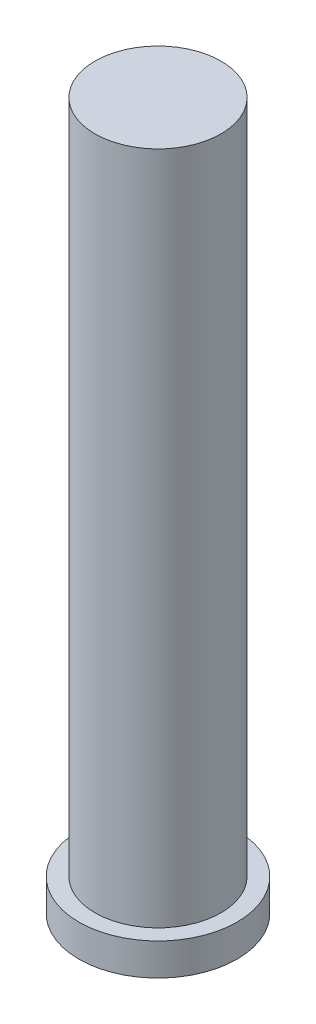
ISO-10303-21;
HEADER;
FILE_DESCRIPTION(('STEP AP214'),'2;1');
FILE_NAME('part.step','',(''),(''),'','','');
FILE_SCHEMA(('AUTOMOTIVE_DESIGN { 1 0 10303 214 1 1 1 1 }'));
ENDSEC;
DATA;
#1=APPLICATION_CONTEXT('core data for automotive mechanical design processes');
#2=APPLICATION_PROTOCOL_DEFINITION('international standard','automotive_design',2000,#1);
#3=PRODUCT_CONTEXT('',#1,'mechanical');
#4=PRODUCT('Part','Part','',(#3));
#5=PRODUCT_RELATED_PRODUCT_CATEGORY('part','',(#4));
#6=PRODUCT_DEFINITION_FORMATION('','',#4);
#7=PRODUCT_DEFINITION_CONTEXT('part definition',#1,'design');
#8=PRODUCT_DEFINITION('design','',#6,#7);
#9=PRODUCT_DEFINITION_SHAPE('','',#8);
#10=(LENGTH_UNIT() NAMED_UNIT(*) SI_UNIT(.MILLI.,.METRE.));
#11=(NAMED_UNIT(*) PLANE_ANGLE_UNIT() SI_UNIT($,.RADIAN.));
#12=(NAMED_UNIT(*) SI_UNIT($,.STERADIAN.) SOLID_ANGLE_UNIT());
#13=UNCERTAINTY_MEASURE_WITH_UNIT(LENGTH_MEASURE(1.E-05),#10,'distance_accuracy_value','');
#14=(GEOMETRIC_REPRESENTATION_CONTEXT(3) GLOBAL_UNCERTAINTY_ASSIGNED_CONTEXT((#13)) GLOBAL_UNIT_ASSIGNED_CONTEXT((#10,
#11,#12)) REPRESENTATION_CONTEXT('',''));
#15=CARTESIAN_POINT('',(0.,0.,0.));
#16=DIRECTION('',(0.,0.,1.));
#17=DIRECTION('',(1.,0.,0.));
#18=AXIS2_PLACEMENT_3D('',#15,#16,#17);
#19=CARTESIAN_POINT('',(0.,2.,0.));
#20=DIRECTION('',(0.,-1.,0.));
#21=DIRECTION('',(0.,0.,-1.));
#22=AXIS2_PLACEMENT_3D('',#19,#20,#21);
#23=CYLINDRICAL_SURFACE('',#22,4.925);
#24=CARTESIAN_POINT('',(0.,2.,0.));
#25=DIRECTION('',(0.,1.,0.));
#26=DIRECTION('',(0.,0.,1.));
#27=AXIS2_PLACEMENT_3D('',#24,#25,#26);
#28=CIRCLE('',#27,4.925);
#29=CARTESIAN_POINT('',(0.,2.,4.925));
#30=VERTEX_POINT('',#29);
#31=EDGE_CURVE('E42',#30,#30,#28,.T.);
#32=ORIENTED_EDGE('',*,*,#31,.F.);
#33=EDGE_LOOP('',(#32));
#34=FACE_BOUND('',#33,.T.);
#35=CARTESIAN_POINT('',(0.,0.,0.));
#36=DIRECTION('',(0.,1.,0.));
#37=DIRECTION('',(0.,0.,1.));
#38=AXIS2_PLACEMENT_3D('',#35,#36,#37);
#39=CIRCLE('',#38,4.925);
#40=CARTESIAN_POINT('',(0.,0.,4.925));
#41=VERTEX_POINT('',#40);
#42=EDGE_CURVE('E38',#41,#41,#39,.T.);
#43=ORIENTED_EDGE('',*,*,#42,.T.);
#44=EDGE_LOOP('',(#43));
#45=FACE_BOUND('',#44,.T.);
#46=ADVANCED_FACE('F35',(#34,#45),#23,.T.);
#47=CARTESIAN_POINT('',(0.,2.,0.));
#48=DIRECTION('',(0.,1.,0.));
#49=DIRECTION('',(0.,0.,1.));
#50=AXIS2_PLACEMENT_3D('',#47,#48,#49);
#51=PLANE('',#50);
#52=CARTESIAN_POINT('',(0.,2.,0.));
#53=DIRECTION('',(0.,1.,0.));
#54=DIRECTION('',(0.,0.,1.));
#55=AXIS2_PLACEMENT_3D('',#52,#53,#54);
#56=CIRCLE('',#55,3.925);
#57=CARTESIAN_POINT('',(0.,2.,3.925));
#58=VERTEX_POINT('',#57);
#59=EDGE_CURVE('E10',#58,#58,#56,.T.);
#60=ORIENTED_EDGE('',*,*,#59,.F.);
#61=EDGE_LOOP('',(#60));
#62=FACE_BOUND('',#61,.T.);
#63=ORIENTED_EDGE('',*,*,#31,.T.);
#64=EDGE_LOOP('',(#63));
#65=FACE_BOUND('',#64,.T.);
#66=ADVANCED_FACE('F59',(#62,#65),#51,.T.);
#67=CARTESIAN_POINT('',(0.,0.,0.));
#68=DIRECTION('',(0.,1.,0.));
#69=DIRECTION('',(0.,0.,1.));
#70=AXIS2_PLACEMENT_3D('',#67,#68,#69);
#71=PLANE('',#70);
#72=ORIENTED_EDGE('',*,*,#42,.F.);
#73=EDGE_LOOP('',(#72));
#74=FACE_BOUND('',#73,.T.);
#75=ADVANCED_FACE('F56',(#74),#71,.F.);
#76=CARTESIAN_POINT('',(0.,44.,0.));
#77=DIRECTION('',(0.,-1.,0.));
#78=DIRECTION('',(0.,0.,-1.));
#79=AXIS2_PLACEMENT_3D('',#76,#77,#78);
#80=CYLINDRICAL_SURFACE('',#79,3.925);
#81=CARTESIAN_POINT('',(0.,44.,0.));
#82=DIRECTION('',(0.,1.,0.));
#83=DIRECTION('',(0.,0.,1.));
#84=AXIS2_PLACEMENT_3D('',#81,#82,#83);
#85=CIRCLE('',#84,3.925);
#86=CARTESIAN_POINT('',(0.,44.,3.925));
#87=VERTEX_POINT('',#86);
#88=EDGE_CURVE('E48',#87,#87,#85,.T.);
#89=ORIENTED_EDGE('',*,*,#88,.F.);
#90=EDGE_LOOP('',(#89));
#91=FACE_BOUND('',#90,.T.);
#92=ORIENTED_EDGE('',*,*,#59,.T.);
#93=EDGE_LOOP('',(#92));
#94=FACE_BOUND('',#93,.T.);
#95=ADVANCED_FACE('F58',(#91,#94),#80,.T.);
#96=CARTESIAN_POINT('',(0.,44.,0.));
#97=DIRECTION('',(0.,1.,0.));
#98=DIRECTION('',(0.,0.,1.));
#99=AXIS2_PLACEMENT_3D('',#96,#97,#98);
#100=PLANE('',#99);
#101=ORIENTED_EDGE('',*,*,#88,.T.);
#102=EDGE_LOOP('',(#101));
#103=FACE_BOUND('',#102,.T.);
#104=ADVANCED_FACE('F64',(#103),#100,.T.);
#105=CLOSED_SHELL('',(#46,#66,#75,#95,#104));
#106=MANIFOLD_SOLID_BREP('B2',#105);
#107=ADVANCED_BREP_SHAPE_REPRESENTATION('',(#18,#106),#14);
#108=SHAPE_DEFINITION_REPRESENTATION(#9,#107);
ENDSEC;
END-ISO-10303-21;
